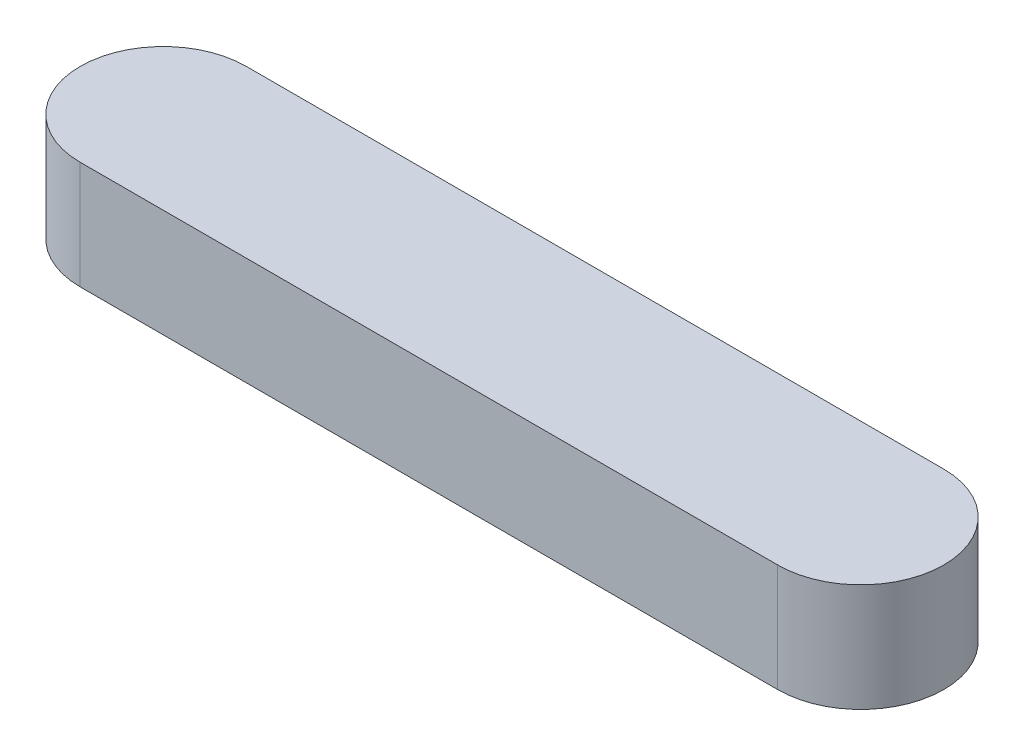
ISO-10303-21;
HEADER;
FILE_DESCRIPTION(('STEP AP214'),'2;1');
FILE_NAME('part.step','',(''),(''),'','','');
FILE_SCHEMA(('AUTOMOTIVE_DESIGN { 1 0 10303 214 1 1 1 1 }'));
ENDSEC;
DATA;
#1=APPLICATION_CONTEXT('core data for automotive mechanical design processes');
#2=APPLICATION_PROTOCOL_DEFINITION('international standard','automotive_design',2000,#1);
#3=PRODUCT_CONTEXT('',#1,'mechanical');
#4=PRODUCT('Part','Part','',(#3));
#5=PRODUCT_RELATED_PRODUCT_CATEGORY('part','',(#4));
#6=PRODUCT_DEFINITION_FORMATION('','',#4);
#7=PRODUCT_DEFINITION_CONTEXT('part definition',#1,'design');
#8=PRODUCT_DEFINITION('design','',#6,#7);
#9=PRODUCT_DEFINITION_SHAPE('','',#8);
#10=(LENGTH_UNIT() NAMED_UNIT(*) SI_UNIT(.MILLI.,.METRE.));
#11=(NAMED_UNIT(*) PLANE_ANGLE_UNIT() SI_UNIT($,.RADIAN.));
#12=(NAMED_UNIT(*) SI_UNIT($,.STERADIAN.) SOLID_ANGLE_UNIT());
#13=UNCERTAINTY_MEASURE_WITH_UNIT(LENGTH_MEASURE(1.E-05),#10,'distance_accuracy_value','');
#14=(GEOMETRIC_REPRESENTATION_CONTEXT(3) GLOBAL_UNCERTAINTY_ASSIGNED_CONTEXT((#13)) GLOBAL_UNIT_ASSIGNED_CONTEXT((#10,
#11,#12)) REPRESENTATION_CONTEXT('',''));
#15=CARTESIAN_POINT('',(0.,0.,0.));
#16=DIRECTION('',(0.,0.,1.));
#17=DIRECTION('',(1.,0.,0.));
#18=AXIS2_PLACEMENT_3D('',#15,#16,#17);
#19=CARTESIAN_POINT('',(-21.,6.5,0.));
#20=DIRECTION('',(0.,-1.,0.));
#21=DIRECTION('',(0.,0.,-1.));
#22=AXIS2_PLACEMENT_3D('',#19,#20,#21);
#23=CYLINDRICAL_SURFACE('',#22,5.);
#24=CARTESIAN_POINT('',(-21.,0.,0.));
#25=DIRECTION('',(0.,1.,0.));
#26=DIRECTION('',(0.,0.,1.));
#27=AXIS2_PLACEMENT_3D('',#24,#25,#26);
#28=CIRCLE('',#27,5.);
#29=CARTESIAN_POINT('',(-21.,0.,-5.));
#30=VERTEX_POINT('',#29);
#31=CARTESIAN_POINT('',(-21.,0.,5.));
#32=VERTEX_POINT('',#31);
#33=EDGE_CURVE('E109',#30,#32,#28,.T.);
#34=ORIENTED_EDGE('',*,*,#33,.T.);
#35=DIRECTION('',(0.,-1.,0.));
#36=VECTOR('',#35,1.);
#37=CARTESIAN_POINT('',(-21.,6.5,5.));
#38=LINE('',#37,#36);
#39=CARTESIAN_POINT('',(-21.,6.5,5.));
#40=VERTEX_POINT('',#39);
#41=EDGE_CURVE('E11',#40,#32,#38,.T.);
#42=ORIENTED_EDGE('',*,*,#41,.F.);
#43=CARTESIAN_POINT('',(-21.,6.5,0.));
#44=DIRECTION('',(0.,1.,0.));
#45=DIRECTION('',(0.,0.,1.));
#46=AXIS2_PLACEMENT_3D('',#43,#44,#45);
#47=CIRCLE('',#46,5.);
#48=CARTESIAN_POINT('',(-21.,6.5,-5.));
#49=VERTEX_POINT('',#48);
#50=EDGE_CURVE('E93',#49,#40,#47,.T.);
#51=ORIENTED_EDGE('',*,*,#50,.F.);
#52=DIRECTION('',(0.,-1.,0.));
#53=VECTOR('',#52,1.);
#54=CARTESIAN_POINT('',(-21.,6.5,-5.));
#55=LINE('',#54,#53);
#56=EDGE_CURVE('E105',#49,#30,#55,.T.);
#57=ORIENTED_EDGE('',*,*,#56,.T.);
#58=EDGE_LOOP('',(#34,#42,#51,#57));
#59=FACE_BOUND('',#58,.T.);
#60=ADVANCED_FACE('F41',(#59),#23,.T.);
#61=CARTESIAN_POINT('',(-21.,6.5,5.));
#62=DIRECTION('',(0.,0.,-1.));
#63=DIRECTION('',(-1.,0.,0.));
#64=AXIS2_PLACEMENT_3D('',#61,#62,#63);
#65=PLANE('',#64);
#66=DIRECTION('',(1.,0.,0.));
#67=VECTOR('',#66,1.);
#68=CARTESIAN_POINT('',(-21.,0.,5.));
#69=LINE('',#68,#67);
#70=CARTESIAN_POINT('',(21.,0.,4.99999999999999));
#71=VERTEX_POINT('',#70);
#72=EDGE_CURVE('E98',#32,#71,#69,.T.);
#73=ORIENTED_EDGE('',*,*,#72,.T.);
#74=DIRECTION('',(0.,-1.,0.));
#75=VECTOR('',#74,1.);
#76=CARTESIAN_POINT('',(21.,6.5,4.99999999999999));
#77=LINE('',#76,#75);
#78=CARTESIAN_POINT('',(21.,6.5,4.99999999999999));
#79=VERTEX_POINT('',#78);
#80=EDGE_CURVE('E50',#79,#71,#77,.T.);
#81=ORIENTED_EDGE('',*,*,#80,.F.);
#82=DIRECTION('',(1.,0.,0.));
#83=VECTOR('',#82,1.);
#84=CARTESIAN_POINT('',(-21.,6.5,5.));
#85=LINE('',#84,#83);
#86=EDGE_CURVE('E88',#40,#79,#85,.T.);
#87=ORIENTED_EDGE('',*,*,#86,.F.);
#88=ORIENTED_EDGE('',*,*,#41,.T.);
#89=EDGE_LOOP('',(#73,#81,#87,#88));
#90=FACE_BOUND('',#89,.T.);
#91=ADVANCED_FACE('F97',(#90),#65,.F.);
#92=CARTESIAN_POINT('',(21.,6.5,0.));
#93=DIRECTION('',(0.,-1.,0.));
#94=DIRECTION('',(0.,0.,-1.));
#95=AXIS2_PLACEMENT_3D('',#92,#93,#94);
#96=CYLINDRICAL_SURFACE('',#95,5.);
#97=CARTESIAN_POINT('',(21.,0.,0.));
#98=DIRECTION('',(0.,1.,0.));
#99=DIRECTION('',(0.,0.,1.));
#100=AXIS2_PLACEMENT_3D('',#97,#98,#99);
#101=CIRCLE('',#100,5.);
#102=CARTESIAN_POINT('',(21.,0.,-5.));
#103=VERTEX_POINT('',#102);
#104=EDGE_CURVE('E75',#71,#103,#101,.T.);
#105=ORIENTED_EDGE('',*,*,#104,.T.);
#106=DIRECTION('',(0.,-1.,0.));
#107=VECTOR('',#106,1.);
#108=CARTESIAN_POINT('',(21.,6.5,-5.));
#109=LINE('',#108,#107);
#110=CARTESIAN_POINT('',(21.,6.5,-5.));
#111=VERTEX_POINT('',#110);
#112=EDGE_CURVE('E100',#111,#103,#109,.T.);
#113=ORIENTED_EDGE('',*,*,#112,.F.);
#114=CARTESIAN_POINT('',(21.,6.5,0.));
#115=DIRECTION('',(0.,1.,0.));
#116=DIRECTION('',(0.,0.,1.));
#117=AXIS2_PLACEMENT_3D('',#114,#115,#116);
#118=CIRCLE('',#117,5.);
#119=EDGE_CURVE('E91',#79,#111,#118,.T.);
#120=ORIENTED_EDGE('',*,*,#119,.F.);
#121=ORIENTED_EDGE('',*,*,#80,.T.);
#122=EDGE_LOOP('',(#105,#113,#120,#121));
#123=FACE_BOUND('',#122,.T.);
#124=ADVANCED_FACE('F101',(#123),#96,.T.);
#125=CARTESIAN_POINT('',(-21.,6.5,-5.));
#126=DIRECTION('',(0.,0.,1.));
#127=DIRECTION('',(1.,0.,0.));
#128=AXIS2_PLACEMENT_3D('',#125,#126,#127);
#129=PLANE('',#128);
#130=DIRECTION('',(-1.,0.,0.));
#131=VECTOR('',#130,1.);
#132=CARTESIAN_POINT('',(-21.,0.,-5.));
#133=LINE('',#132,#131);
#134=EDGE_CURVE('E81',#103,#30,#133,.T.);
#135=ORIENTED_EDGE('',*,*,#134,.T.);
#136=ORIENTED_EDGE('',*,*,#56,.F.);
#137=DIRECTION('',(-1.,0.,0.));
#138=VECTOR('',#137,1.);
#139=CARTESIAN_POINT('',(-21.,6.5,-5.));
#140=LINE('',#139,#138);
#141=EDGE_CURVE('E58',#111,#49,#140,.T.);
#142=ORIENTED_EDGE('',*,*,#141,.F.);
#143=ORIENTED_EDGE('',*,*,#112,.T.);
#144=EDGE_LOOP('',(#135,#136,#142,#143));
#145=FACE_BOUND('',#144,.T.);
#146=ADVANCED_FACE('F122',(#145),#129,.F.);
#147=CARTESIAN_POINT('',(-21.,6.5,0.));
#148=DIRECTION('',(0.,1.,0.));
#149=DIRECTION('',(0.,0.,1.));
#150=AXIS2_PLACEMENT_3D('',#147,#148,#149);
#151=PLANE('',#150);
#152=ORIENTED_EDGE('',*,*,#50,.T.);
#153=ORIENTED_EDGE('',*,*,#86,.T.);
#154=ORIENTED_EDGE('',*,*,#119,.T.);
#155=ORIENTED_EDGE('',*,*,#141,.T.);
#156=EDGE_LOOP('',(#152,#153,#154,#155));
#157=FACE_BOUND('',#156,.T.);
#158=ADVANCED_FACE('F89',(#157),#151,.T.);
#159=CARTESIAN_POINT('',(-21.,0.,0.));
#160=DIRECTION('',(0.,1.,0.));
#161=DIRECTION('',(0.,0.,1.));
#162=AXIS2_PLACEMENT_3D('',#159,#160,#161);
#163=PLANE('',#162);
#164=ORIENTED_EDGE('',*,*,#33,.F.);
#165=ORIENTED_EDGE('',*,*,#134,.F.);
#166=ORIENTED_EDGE('',*,*,#104,.F.);
#167=ORIENTED_EDGE('',*,*,#72,.F.);
#168=EDGE_LOOP('',(#164,#165,#166,#167));
#169=FACE_BOUND('',#168,.T.);
#170=ADVANCED_FACE('F125',(#169),#163,.F.);
#171=CLOSED_SHELL('',(#60,#91,#124,#146,#158,#170));
#172=MANIFOLD_SOLID_BREP('B2',#171);
#173=ADVANCED_BREP_SHAPE_REPRESENTATION('',(#18,#172),#14);
#174=SHAPE_DEFINITION_REPRESENTATION(#9,#173);
ENDSEC;
END-ISO-10303-21;
